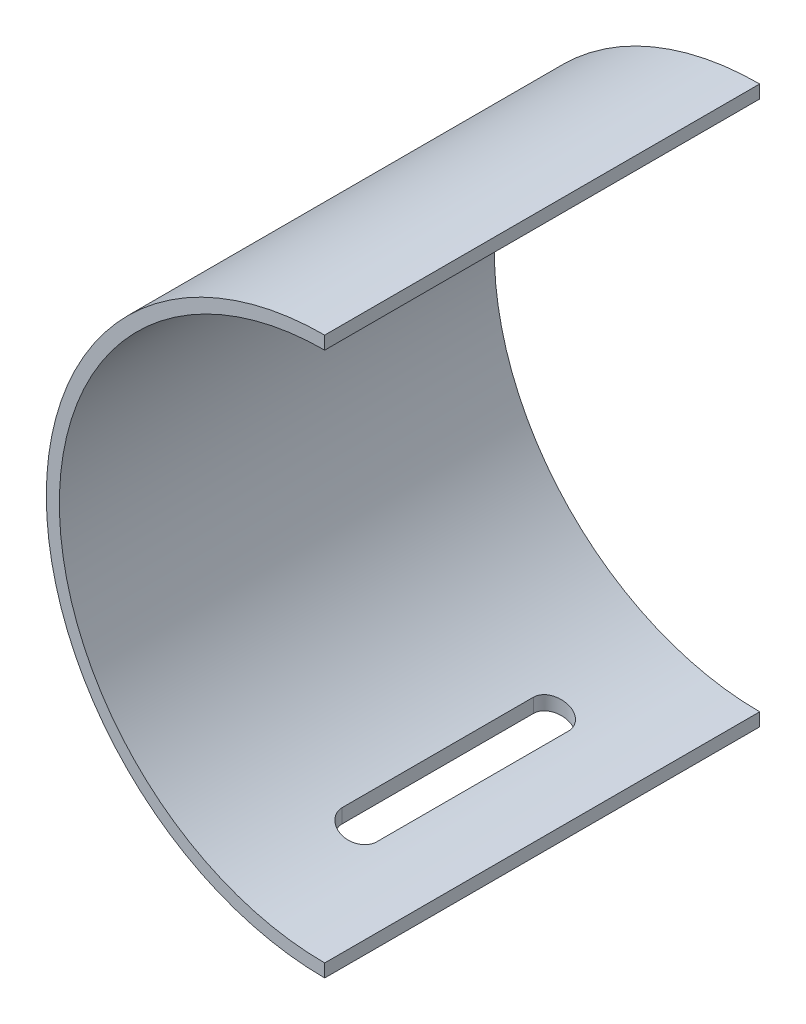
ISO-10303-21;
HEADER;
FILE_DESCRIPTION(('STEP AP214'),'2;1');
FILE_NAME('part.step','',(''),(''),'','','');
FILE_SCHEMA(('AUTOMOTIVE_DESIGN { 1 0 10303 214 1 1 1 1 }'));
ENDSEC;
DATA;
#1=APPLICATION_CONTEXT('core data for automotive mechanical design processes');
#2=APPLICATION_PROTOCOL_DEFINITION('international standard','automotive_design',2000,#1);
#3=PRODUCT_CONTEXT('',#1,'mechanical');
#4=PRODUCT('Part','Part','',(#3));
#5=PRODUCT_RELATED_PRODUCT_CATEGORY('part','',(#4));
#6=PRODUCT_DEFINITION_FORMATION('','',#4);
#7=PRODUCT_DEFINITION_CONTEXT('part definition',#1,'design');
#8=PRODUCT_DEFINITION('design','',#6,#7);
#9=PRODUCT_DEFINITION_SHAPE('','',#8);
#10=(LENGTH_UNIT() NAMED_UNIT(*) SI_UNIT(.MILLI.,.METRE.));
#11=(NAMED_UNIT(*) PLANE_ANGLE_UNIT() SI_UNIT($,.RADIAN.));
#12=(NAMED_UNIT(*) SI_UNIT($,.STERADIAN.) SOLID_ANGLE_UNIT());
#13=UNCERTAINTY_MEASURE_WITH_UNIT(LENGTH_MEASURE(1.E-05),#10,'distance_accuracy_value','');
#14=(GEOMETRIC_REPRESENTATION_CONTEXT(3) GLOBAL_UNCERTAINTY_ASSIGNED_CONTEXT((#13)) GLOBAL_UNIT_ASSIGNED_CONTEXT((#10,
#11,#12)) REPRESENTATION_CONTEXT('',''));
#15=CARTESIAN_POINT('',(0.,0.,0.));
#16=DIRECTION('',(0.,0.,1.));
#17=DIRECTION('',(1.,0.,0.));
#18=AXIS2_PLACEMENT_3D('',#15,#16,#17);
#19=CARTESIAN_POINT('',(0.,0.,25.));
#20=DIRECTION('',(0.,0.,-1.));
#21=DIRECTION('',(-1.,0.,0.));
#22=AXIS2_PLACEMENT_3D('',#19,#20,#21);
#23=CYLINDRICAL_SURFACE('',#22,16.);
#24=DIRECTION('',(0.,0.,-1.));
#25=VECTOR('',#24,1.);
#26=CARTESIAN_POINT('',(-4.,-15.4919333848297,25.));
#27=LINE('',#26,#25);
#28=CARTESIAN_POINT('',(-4.,-15.4919333848297,18.));
#29=VERTEX_POINT('',#28);
#30=CARTESIAN_POINT('',(-4.,-15.4919333848297,7.));
#31=VERTEX_POINT('',#30);
#32=EDGE_CURVE('E118',#29,#31,#27,.T.);
#33=ORIENTED_EDGE('',*,*,#32,.T.);
#34=CARTESIAN_POINT('',(-4.,-15.4919333848297,7.));
#35=CARTESIAN_POINT('',(-3.99999973983562,-15.4919330247826,6.97256292090004));
#36=CARTESIAN_POINT('',(-4.00112994232878,-15.4916416818939,6.94513916553065));
#37=CARTESIAN_POINT('',(-4.00563579160022,-15.4904773948194,6.89049185793874));
#38=CARTESIAN_POINT('',(-4.00901122045016,-15.48960450708,6.86326828654504));
#39=CARTESIAN_POINT('',(-4.02246152576873,-15.4861194126377,6.78227618443451));
#40=CARTESIAN_POINT('',(-4.03586058732038,-15.4826407635821,6.72905677349611));
#41=CARTESIAN_POINT('',(-4.07107973850288,-15.4734171015838,6.62571065428171));
#42=CARTESIAN_POINT('',(-4.09290179545415,-15.4676715591661,6.57558467169842));
#43=CARTESIAN_POINT('',(-4.14424580130178,-15.4539939771053,6.47977179529503));
#44=CARTESIAN_POINT('',(-4.17376760531779,-15.4460619786028,6.43408481797171));
#45=CARTESIAN_POINT('',(-4.23994099866851,-15.4280292240394,6.34785114576807));
#46=CARTESIAN_POINT('',(-4.27666957428775,-15.4179049155632,6.30736855077202));
#47=CARTESIAN_POINT('',(-4.35589502491443,-15.3957094203021,6.23313824088572));
#48=CARTESIAN_POINT('',(-4.39839330505151,-15.3836377591319,6.19939217154167));
#49=CARTESIAN_POINT('',(-4.48925876034375,-15.357371373844,6.13847524649913));
#50=CARTESIAN_POINT('',(-4.53776472325966,-15.3431234133016,6.11153454278722));
#51=CARTESIAN_POINT('',(-4.63814271594516,-15.3130786128445,6.06613962145427));
#52=CARTESIAN_POINT('',(-4.69001517054129,-15.2972815773188,6.04768647728641));
#53=CARTESIAN_POINT('',(-4.79784143481776,-15.2638143076667,6.01899670388754));
#54=CARTESIAN_POINT('',(-4.85387549128621,-15.2460943294004,6.00911972091497));
#55=CARTESIAN_POINT('',(-4.96652598196081,-15.209770703552,5.99896050908363));
#56=CARTESIAN_POINT('',(-5.02314255391275,-15.1911668430149,5.99868060432331));
#57=CARTESIAN_POINT('',(-5.13759243796357,-15.1528518293431,6.00778768975717));
#58=CARTESIAN_POINT('',(-5.19539199517962,-15.1331252922097,6.01753683141622));
#59=CARTESIAN_POINT('',(-5.30846844344179,-15.093831482944,6.04697236293841));
#60=CARTESIAN_POINT('',(-5.36374493414325,-15.0742642364888,6.06666032389637));
#61=CARTESIAN_POINT('',(-5.4710087399841,-15.0356695644859,6.11587248681972));
#62=CARTESIAN_POINT('',(-5.52293807533286,-15.0166537786964,6.14553263695816));
#63=CARTESIAN_POINT('',(-5.62105238553934,-14.9802040002159,6.21395347227302));
#64=CARTESIAN_POINT('',(-5.66723805748111,-14.9627698156423,6.25271305143826));
#65=CARTESIAN_POINT('',(-5.75111126181659,-14.9307294803238,6.33722027957567));
#66=CARTESIAN_POINT('',(-5.78899952871494,-14.9160581275467,6.38274342707655));
#67=CARTESIAN_POINT('',(-5.85645506255707,-14.8897028485076,6.48038402558137));
#68=CARTESIAN_POINT('',(-5.88602305643827,-14.8780186612669,6.53250089991811));
#69=CARTESIAN_POINT('',(-5.93396582870289,-14.8589594169043,6.6382496773566));
#70=CARTESIAN_POINT('',(-5.95293549607883,-14.8513565729964,6.69157155242979));
#71=CARTESIAN_POINT('',(-5.98161499796373,-14.8398290647066,6.80096963668632));
#72=CARTESIAN_POINT('',(-5.99134569990303,-14.8358961117366,6.85703933661442));
#73=CARTESIAN_POINT('',(-5.99750215786954,-14.8334071426752,6.92788870782283));
#74=CARTESIAN_POINT('',(-5.99843914489681,-14.8330282649832,6.94230332362898));
#75=CARTESIAN_POINT('',(-5.99968710555152,-14.8325235835769,6.97114327897172));
#76=CARTESIAN_POINT('',(-5.99999897831321,-14.8323974163762,6.98556857320802));
#77=CARTESIAN_POINT('',(-6.,-14.8323969741913,7.));
#78=B_SPLINE_CURVE_WITH_KNOTS('',3,(#34,#35,#36,#37,#38,#39,#40,#41,#42,#43,#44,#45,#46,#47,#48,
#49,#50,#51,#52,#53,#54,#55,#56,#57,#58,#59,#60,#61,#62,#63,#64,#65,#66,#67,#68,#69,#70,#71,#72,
#73,#74,#75,#76,#77),.UNSPECIFIED.,.F.,.F.,(4,2,2,2,2,2,2,2,2,2,2,2,2,2,2,2,2,2,2,2,2,4),(0.,
0.0822600525181318,0.164512121796549,0.328632789316776,0.492791812967296,0.656947747983393,
0.822963455366363,0.989019666287772,1.16010624544412,1.3312144566099,1.5091927736079,
1.68721419082914,1.87189761633041,2.05661024510666,2.2439506403412,2.43126827663215,
2.6133727842585,2.79546137657634,2.96590530015049,3.13596333122255,3.17930381820689,
3.22258192146009),.UNSPECIFIED.);
#79=CARTESIAN_POINT('',(-6.,-14.8323969741913,7.));
#80=VERTEX_POINT('',#79);
#81=EDGE_CURVE('E112',#31,#80,#78,.T.);
#82=ORIENTED_EDGE('',*,*,#81,.T.);
#83=DIRECTION('',(0.,0.,-1.));
#84=VECTOR('',#83,1.);
#85=CARTESIAN_POINT('',(-6.,-14.8323969741913,25.));
#86=LINE('',#85,#84);
#87=CARTESIAN_POINT('',(-6.,-14.8323969741913,18.));
#88=VERTEX_POINT('',#87);
#89=EDGE_CURVE('E101',#80,#88,#86,.F.);
#90=ORIENTED_EDGE('',*,*,#89,.T.);
#91=CARTESIAN_POINT('',(-6.,-14.8323969741913,18.));
#92=CARTESIAN_POINT('',(-6.0000008520435,-14.8323961879059,18.02672889563));
#93=CARTESIAN_POINT('',(-5.99892760578459,-14.8328308246687,18.0534443272946));
#94=CARTESIAN_POINT('',(-5.99465289693016,-14.8345591300802,18.1066705661017));
#95=CARTESIAN_POINT('',(-5.99145190394329,-14.8358526091764,18.1331814170908));
#96=CARTESIAN_POINT('',(-5.9787184109148,-14.840991029057,18.2119612618623));
#97=CARTESIAN_POINT('',(-5.96605504852281,-14.8460941457176,18.2636802301663));
#98=CARTESIAN_POINT('',(-5.93287936461706,-14.8593827875895,18.3640522696193));
#99=CARTESIAN_POINT('',(-5.9123698244845,-14.8675672204927,18.4127064201015));
#100=CARTESIAN_POINT('',(-5.86423851355928,-14.8866172940697,18.505804774056));
#101=CARTESIAN_POINT('',(-5.83661358461498,-14.8974841252313,18.5502470961037));
#102=CARTESIAN_POINT('',(-5.77411617454355,-14.9218209545457,18.6353129784785));
#103=CARTESIAN_POINT('',(-5.73903261369465,-14.9353657163614,18.6757596291788));
#104=CARTESIAN_POINT('',(-5.66327156151315,-14.9642573497591,18.7502638634287));
#105=CARTESIAN_POINT('',(-5.6225922612015,-14.9796048038763,18.7843193724116));
#106=CARTESIAN_POINT('',(-5.53380822373149,-15.0126398134589,18.8474742600186));
#107=CARTESIAN_POINT('',(-5.48538758776591,-15.0304154026539,18.8760838015739));
#108=CARTESIAN_POINT('',(-5.38470086579088,-15.066780098131,18.9247343691115));
#109=CARTESIAN_POINT('',(-5.33243387279689,-15.0853693958671,18.9447733664922));
#110=CARTESIAN_POINT('',(-5.22267248451847,-15.1237308462318,18.9766491943482));
#111=CARTESIAN_POINT('',(-5.16504739080522,-15.1435154704708,18.9880228535995));
#112=CARTESIAN_POINT('',(-5.04857393819264,-15.1827427779188,19.0005359028899));
#113=CARTESIAN_POINT('',(-4.98972540970631,-15.202185413024,19.0016738644936));
#114=CARTESIAN_POINT('',(-4.87179884618219,-15.2403890474311,18.9935265929885));
#115=CARTESIAN_POINT('',(-4.81272541566208,-15.2591401874158,18.9841264845097));
#116=CARTESIAN_POINT('',(-4.69679305412295,-15.2952221602572,18.9547979258067));
#117=CARTESIAN_POINT('',(-4.63993385209527,-15.3125531672184,18.9348707684081));
#118=CARTESIAN_POINT('',(-4.53168938707401,-15.3449308962526,18.885512251619));
#119=CARTESIAN_POINT('',(-4.48020089432146,-15.3600249345659,18.8563387433986));
#120=CARTESIAN_POINT('',(-4.38280438718998,-15.3880991932979,18.7890314312536));
#121=CARTESIAN_POINT('',(-4.33689479459962,-15.4010800118785,18.750900170377));
#122=CARTESIAN_POINT('',(-4.25407494755664,-15.4241570801834,18.6684799375305));
#123=CARTESIAN_POINT('',(-4.2168677323297,-15.4343515742492,18.6245168040019));
#124=CARTESIAN_POINT('',(-4.15036876422071,-15.452366500228,18.5305084517204));
#125=CARTESIAN_POINT('',(-4.12107769143761,-15.4601867281679,18.480462710928));
#126=CARTESIAN_POINT('',(-4.07240502478738,-15.4730775946559,18.3777328076905));
#127=CARTESIAN_POINT('',(-4.05269880377174,-15.4782387226149,18.3252132079103));
#128=CARTESIAN_POINT('',(-4.02234165402732,-15.4861556948547,18.2174937039346));
#129=CARTESIAN_POINT('',(-4.0116755368278,-15.4889155737332,18.1622984607974));
#130=CARTESIAN_POINT('',(-4.00380101344556,-15.4909515101747,18.0889238314106));
#131=CARTESIAN_POINT('',(-4.00237503985722,-15.491319970325,18.0711555170856));
#132=CARTESIAN_POINT('',(-4.00047585694099,-15.491810561084,18.0355940217186));
#133=CARTESIAN_POINT('',(-4.00000107991749,-15.4919330970083,18.0178009300382));
#134=CARTESIAN_POINT('',(-4.,-15.4919333848297,18.));
#135=B_SPLINE_CURVE_WITH_KNOTS('',3,(#91,#92,#93,#94,#95,#96,#97,#98,#99,#100,#101,#102,#103,
#104,#105,#106,#107,#108,#109,#110,#111,#112,#113,#114,#115,#116,#117,#118,#119,#120,#121,#122,
#123,#124,#125,#126,#127,#128,#129,#130,#131,#132,#133,#134),.UNSPECIFIED.,.F.,.F.,(4,2,2,2,2,2,
2,2,2,2,2,2,2,2,2,2,2,2,2,2,2,4),(0.,0.080135223028483,0.160252765520635,0.319887871738869,
0.479466441476616,0.639115962276051,0.804092716840169,0.969122930639355,1.14529497873773,
1.32150870276538,1.50658428293677,1.69168569079727,1.8788246763324,2.06594068469373,
2.24824014360892,2.43048791129898,2.6050822261618,2.77969153616822,2.94788365636984,
3.11579263005833,3.16926120180057,3.2226415776524),.UNSPECIFIED.);
#136=EDGE_CURVE('E106',#88,#29,#135,.T.);
#137=ORIENTED_EDGE('',*,*,#136,.T.);
#138=EDGE_LOOP('',(#33,#82,#90,#137));
#139=FACE_BOUND('',#138,.T.);
#140=CARTESIAN_POINT('',(0.,0.,0.));
#141=DIRECTION('',(0.,0.,1.));
#142=DIRECTION('',(1.,0.,0.));
#143=AXIS2_PLACEMENT_3D('',#140,#141,#142);
#144=CIRCLE('',#143,16.);
#145=CARTESIAN_POINT('',(0.,16.,0.));
#146=VERTEX_POINT('',#145);
#147=CARTESIAN_POINT('',(0.,-16.,0.));
#148=VERTEX_POINT('',#147);
#149=EDGE_CURVE('E119',#146,#148,#144,.T.);
#150=ORIENTED_EDGE('',*,*,#149,.T.);
#151=DIRECTION('',(0.,0.,-1.));
#152=VECTOR('',#151,1.);
#153=CARTESIAN_POINT('',(0.,-16.,25.));
#154=LINE('',#153,#152);
#155=CARTESIAN_POINT('',(0.,-16.,25.));
#156=VERTEX_POINT('',#155);
#157=EDGE_CURVE('E185',#156,#148,#154,.T.);
#158=ORIENTED_EDGE('',*,*,#157,.F.);
#159=CARTESIAN_POINT('',(0.,0.,25.));
#160=DIRECTION('',(0.,0.,1.));
#161=DIRECTION('',(1.,0.,0.));
#162=AXIS2_PLACEMENT_3D('',#159,#160,#161);
#163=CIRCLE('',#162,16.);
#164=CARTESIAN_POINT('',(0.,16.,25.));
#165=VERTEX_POINT('',#164);
#166=EDGE_CURVE('E131',#165,#156,#163,.T.);
#167=ORIENTED_EDGE('',*,*,#166,.F.);
#168=DIRECTION('',(0.,0.,-1.));
#169=VECTOR('',#168,1.);
#170=CARTESIAN_POINT('',(0.,16.,25.));
#171=LINE('',#170,#169);
#172=EDGE_CURVE('E196',#165,#146,#171,.T.);
#173=ORIENTED_EDGE('',*,*,#172,.T.);
#174=EDGE_LOOP('',(#150,#158,#167,#173));
#175=FACE_BOUND('',#174,.T.);
#176=ADVANCED_FACE('F33',(#139,#175),#23,.T.);
#177=CARTESIAN_POINT('',(0.,-15.25,25.));
#178=DIRECTION('',(-1.,0.,0.));
#179=DIRECTION('',(0.,0.,1.));
#180=AXIS2_PLACEMENT_3D('',#177,#178,#179);
#181=PLANE('',#180);
#182=DIRECTION('',(0.,1.,0.));
#183=VECTOR('',#182,1.);
#184=CARTESIAN_POINT('',(0.,-15.25,0.));
#185=LINE('',#184,#183);
#186=CARTESIAN_POINT('',(0.,-15.25,0.));
#187=VERTEX_POINT('',#186);
#188=EDGE_CURVE('E122',#148,#187,#185,.T.);
#189=ORIENTED_EDGE('',*,*,#188,.T.);
#190=DIRECTION('',(0.,0.,-1.));
#191=VECTOR('',#190,1.);
#192=CARTESIAN_POINT('',(0.,-15.25,25.));
#193=LINE('',#192,#191);
#194=CARTESIAN_POINT('',(0.,-15.25,25.));
#195=VERTEX_POINT('',#194);
#196=EDGE_CURVE('E187',#195,#187,#193,.T.);
#197=ORIENTED_EDGE('',*,*,#196,.F.);
#198=DIRECTION('',(0.,1.,0.));
#199=VECTOR('',#198,1.);
#200=CARTESIAN_POINT('',(0.,-15.25,25.));
#201=LINE('',#200,#199);
#202=EDGE_CURVE('E207',#156,#195,#201,.T.);
#203=ORIENTED_EDGE('',*,*,#202,.F.);
#204=ORIENTED_EDGE('',*,*,#157,.T.);
#205=EDGE_LOOP('',(#189,#197,#203,#204));
#206=FACE_BOUND('',#205,.T.);
#207=ADVANCED_FACE('F154',(#206),#181,.F.);
#208=CARTESIAN_POINT('',(0.,0.,25.));
#209=DIRECTION('',(0.,0.,-1.));
#210=DIRECTION('',(-1.,0.,0.));
#211=AXIS2_PLACEMENT_3D('',#208,#209,#210);
#212=CYLINDRICAL_SURFACE('',#211,15.25);
#213=DIRECTION('',(0.,0.,-1.));
#214=VECTOR('',#213,1.);
#215=CARTESIAN_POINT('',(-6.,-14.02007489281,25.));
#216=LINE('',#215,#214);
#217=CARTESIAN_POINT('',(-6.,-14.02007489281,18.));
#218=VERTEX_POINT('',#217);
#219=CARTESIAN_POINT('',(-6.,-14.02007489281,7.));
#220=VERTEX_POINT('',#219);
#221=EDGE_CURVE('E165',#218,#220,#216,.T.);
#222=ORIENTED_EDGE('',*,*,#221,.T.);
#223=CARTESIAN_POINT('',(-6.,-14.02007489281,7.));
#224=CARTESIAN_POINT('',(-6.0000009517237,-14.0200740202685,6.97341703752054));
#225=CARTESIAN_POINT('',(-5.99893927682452,-14.0205288851952,6.94684754616679));
#226=CARTESIAN_POINT('',(-5.99471139359388,-14.0223372949638,6.89391362612556));
#227=CARTESIAN_POINT('',(-5.99154568969447,-14.0236906244027,6.86754914981897));
#228=CARTESIAN_POINT('',(-5.97895615397309,-14.0290652308148,6.78921848016366));
#229=CARTESIAN_POINT('',(-5.96643951632117,-14.0344013475904,6.73780184824804));
#230=CARTESIAN_POINT('',(-5.93366848980978,-14.0482877944197,6.63802705266305));
#231=CARTESIAN_POINT('',(-5.91341752323385,-14.0568367028515,6.58966754729202));
#232=CARTESIAN_POINT('',(-5.86592035975518,-14.0767233120869,6.4971201558832));
#233=CARTESIAN_POINT('',(-5.83867060459626,-14.0880624313391,6.45293440750221));
#234=CARTESIAN_POINT('',(-5.77695453870017,-14.1134845780279,6.36818518929233));
#235=CARTESIAN_POINT('',(-5.74226042695207,-14.1276529082227,6.32781371782164));
#236=CARTESIAN_POINT('',(-5.66735516781194,-14.157867627559,6.25338965249668));
#237=CARTESIAN_POINT('',(-5.6271421840468,-14.1739146415595,6.21933917082538));
#238=CARTESIAN_POINT('',(-5.53907233150255,-14.2085740503904,6.15586580309763));
#239=CARTESIAN_POINT('',(-5.4908687190483,-14.2272885494209,6.12697942177555));
#240=CARTESIAN_POINT('',(-5.39059952326082,-14.2655815919395,6.07774518461791));
#241=CARTESIAN_POINT('',(-5.33853291116855,-14.2851603650267,6.05739961296744));
#242=CARTESIAN_POINT('',(-5.2288360020778,-14.3256893922949,6.02476251986394));
#243=CARTESIAN_POINT('',(-5.17105742931061,-14.3466550208421,6.01298620029746));
#244=CARTESIAN_POINT('',(-5.05419887684799,-14.3882389840714,5.99973938563632));
#245=CARTESIAN_POINT('',(-4.99511869563442,-14.4088572640917,5.99827049777184));
#246=CARTESIAN_POINT('',(-4.87654661213838,-14.4494210046271,6.00585106331761));
#247=CARTESIAN_POINT('',(-4.81705902913567,-14.4693545738439,6.01503452150432));
#248=CARTESIAN_POINT('',(-4.70024167046277,-14.5077223559213,6.04408903062727));
#249=CARTESIAN_POINT('',(-4.64291160524894,-14.5261567703601,6.0639586419461));
#250=CARTESIAN_POINT('',(-4.53385874533724,-14.5605564911266,6.11332473909982));
#251=CARTESIAN_POINT('',(-4.4820233313896,-14.5765768179528,6.14253355903713));
#252=CARTESIAN_POINT('',(-4.38393760721465,-14.6063760250664,6.2100577457379));
#253=CARTESIAN_POINT('',(-4.33768555468891,-14.6201556050514,6.24837026054088));
#254=CARTESIAN_POINT('',(-4.25444225466291,-14.6445901375483,6.3311004197905));
#255=CARTESIAN_POINT('',(-4.2171204205149,-14.6553605783424,6.3751513974079));
#256=CARTESIAN_POINT('',(-4.15041226018828,-14.6743921795425,6.46940476964764));
#257=CARTESIAN_POINT('',(-4.12102640113804,-14.6826531922417,6.51960752612403));
#258=CARTESIAN_POINT('',(-4.07231797014301,-14.6962356379195,6.62248762411951));
#259=CARTESIAN_POINT('',(-4.05263366053343,-14.701663275544,6.67498037095761));
#260=CARTESIAN_POINT('',(-4.02230897133049,-14.709989203176,6.78265982077076));
#261=CARTESIAN_POINT('',(-4.01165324018912,-14.7128917868298,6.83784178151481));
#262=CARTESIAN_POINT('',(-4.0037918081082,-14.7150315120666,6.91118362432902));
#263=CARTESIAN_POINT('',(-4.00236930444774,-14.7154184558923,6.9289302900394));
#264=CARTESIAN_POINT('',(-4.0004747243716,-14.71593366142,6.96444873989527));
#265=CARTESIAN_POINT('',(-4.00000108669614,-14.7160623480579,6.98222043455171));
#266=CARTESIAN_POINT('',(-4.,-14.7160626527614,7.));
#267=B_SPLINE_CURVE_WITH_KNOTS('',3,(#223,#224,#225,#226,#227,#228,#229,#230,#231,#232,#233,
#234,#235,#236,#237,#238,#239,#240,#241,#242,#243,#244,#245,#246,#247,#248,#249,#250,#251,#252,
#253,#254,#255,#256,#257,#258,#259,#260,#261,#262,#263,#264,#265,#266),.UNSPECIFIED.,.F.,.F.,(4,
2,2,2,2,2,2,2,2,2,2,2,2,2,2,2,2,2,2,2,2,4),(0.,0.079697435734223,0.159375771233883,
0.318101378258354,0.476756833640438,0.635493111312853,0.800044541279809,0.964650858148532,
1.14156713295997,1.31853069280326,1.50541057167995,1.6923195899502,1.88160562721959,
2.07086617063381,2.25478275351953,2.4386417957138,2.61395258929253,2.78927369978953,
2.9574400523793,3.12531988983804,3.17872403028124,3.23204022738546),.UNSPECIFIED.);
#268=CARTESIAN_POINT('',(-4.,-14.7160626527614,7.));
#269=VERTEX_POINT('',#268);
#270=EDGE_CURVE('E11',#220,#269,#267,.T.);
#271=ORIENTED_EDGE('',*,*,#270,.T.);
#272=DIRECTION('',(0.,0.,-1.));
#273=VECTOR('',#272,1.);
#274=CARTESIAN_POINT('',(-4.,-14.7160626527614,25.));
#275=LINE('',#274,#273);
#276=CARTESIAN_POINT('',(-4.,-14.7160626527614,18.));
#277=VERTEX_POINT('',#276);
#278=EDGE_CURVE('E47',#269,#277,#275,.F.);
#279=ORIENTED_EDGE('',*,*,#278,.T.);
#280=CARTESIAN_POINT('',(-4.,-14.7160626527614,18.));
#281=CARTESIAN_POINT('',(-3.99999969642953,-14.7160622870358,18.0273658062516));
#282=CARTESIAN_POINT('',(-4.00112408391933,-14.7157571625541,18.0547183037965));
#283=CARTESIAN_POINT('',(-4.00560644476384,-14.7145378791667,18.1092231936966));
#284=CARTESIAN_POINT('',(-4.00896419001887,-14.7136237824571,18.1363756062006));
#285=CARTESIAN_POINT('',(-4.02234263913248,-14.7099745242227,18.2171512484014));
#286=CARTESIAN_POINT('',(-4.03566873131481,-14.7063323814509,18.2702261114158));
#287=CARTESIAN_POINT('',(-4.07068699719464,-14.6966776141434,18.3732887486016));
#288=CARTESIAN_POINT('',(-4.092380928107,-14.6906644917049,18.4232758717995));
#289=CARTESIAN_POINT('',(-4.14340815271285,-14.6763540543664,18.5188280676224));
#290=CARTESIAN_POINT('',(-4.17274144232574,-14.6680567406865,18.5643931426093));
#291=CARTESIAN_POINT('',(-4.23850651627756,-14.6491891712644,18.6504596941645));
#292=CARTESIAN_POINT('',(-4.27502203757186,-14.6385919335353,18.6908911563168));
#293=CARTESIAN_POINT('',(-4.35376608518856,-14.6153653292241,18.7650545804241));
#294=CARTESIAN_POINT('',(-4.39599604733926,-14.602735451763,18.798784853343));
#295=CARTESIAN_POINT('',(-4.48640015932943,-14.5752192359852,18.859818457454));
#296=CARTESIAN_POINT('',(-4.53472559300368,-14.5602716854718,18.8868698949234));
#297=CARTESIAN_POINT('',(-4.634715691004,-14.5287528175933,18.9325179746139));
#298=CARTESIAN_POINT('',(-4.68638083213441,-14.5121812681976,18.9511134065271));
#299=CARTESIAN_POINT('',(-4.79398426133585,-14.4770009102941,18.9802035894063));
#300=CARTESIAN_POINT('',(-4.8500104673425,-14.4583343912393,18.9903033040125));
#301=CARTESIAN_POINT('',(-4.96264864896627,-14.420061012047,19.0009032132534));
#302=CARTESIAN_POINT('',(-5.01926077432933,-14.4004539066206,19.0014008900464));
#303=CARTESIAN_POINT('',(-5.13395218136463,-14.3599750299356,18.9927232832513));
#304=CARTESIAN_POINT('',(-5.19199463669873,-14.3390845673576,18.9831450748696));
#305=CARTESIAN_POINT('',(-5.30557082442353,-14.2974501285635,18.9539735617517));
#306=CARTESIAN_POINT('',(-5.36110410371718,-14.2767061793702,18.9343784560082));
#307=CARTESIAN_POINT('',(-5.46901510050087,-14.2357212676991,18.8852102380821));
#308=CARTESIAN_POINT('',(-5.52132631566022,-14.215494089492,18.8554791042763));
#309=CARTESIAN_POINT('',(-5.62018423253494,-14.1767010124118,18.7867613375467));
#310=CARTESIAN_POINT('',(-5.66673162986512,-14.1581349131442,18.7477758231613));
#311=CARTESIAN_POINT('',(-5.75115872549275,-14.1240464292333,18.6627525502496));
#312=CARTESIAN_POINT('',(-5.78925773568675,-14.108449057278,18.6169633266065));
#313=CARTESIAN_POINT('',(-5.85706563619574,-14.0804344239079,18.5186507613552));
#314=CARTESIAN_POINT('',(-5.88677574613846,-14.0680167002414,18.4661284002663));
#315=CARTESIAN_POINT('',(-5.93469419499267,-14.0478658499306,18.3598649306402));
#316=CARTESIAN_POINT('',(-5.95356912404289,-14.0398628217165,18.3064748004784));
#317=CARTESIAN_POINT('',(-5.98204400292006,-14.0277544508198,18.1969155918201));
#318=CARTESIAN_POINT('',(-5.99166571633916,-14.0236399626748,18.1407533623275));
#319=CARTESIAN_POINT('',(-5.99763313151606,-14.0210875576716,18.0701980249712));
#320=CARTESIAN_POINT('',(-5.99852097105386,-14.0207077495263,18.0561654021173));
#321=CARTESIAN_POINT('',(-5.99970347826765,-14.0202018303171,18.0280904781771));
#322=CARTESIAN_POINT('',(-5.99999898270914,-14.0200753613722,18.0140482188155));
#323=CARTESIAN_POINT('',(-6.,-14.02007489281,18.));
#324=B_SPLINE_CURVE_WITH_KNOTS('',3,(#280,#281,#282,#283,#284,#285,#286,#287,#288,#289,#290,
#291,#292,#293,#294,#295,#296,#297,#298,#299,#300,#301,#302,#303,#304,#305,#306,#307,#308,#309,
#310,#311,#312,#313,#314,#315,#316,#317,#318,#319,#320,#321,#322,#323),.UNSPECIFIED.,.F.,.F.,(4,
2,2,2,2,2,2,2,2,2,2,2,2,2,2,2,2,2,2,2,2,4),(0.,0.0820462984037124,0.164084218452784,
0.327765529787585,0.491481232315816,0.655196847394913,0.820948342165643,0.986741561777732,
1.15806474282664,1.32941243764747,1.50834526026887,1.68732500193283,1.873744191037,
2.06019690953293,2.2497005149153,2.43918122744052,2.62293960711043,2.80667125713272,
2.9773646932832,3.14765566889505,3.18984437801802,3.23197344690451),.UNSPECIFIED.);
#325=EDGE_CURVE('E158',#277,#218,#324,.T.);
#326=ORIENTED_EDGE('',*,*,#325,.T.);
#327=EDGE_LOOP('',(#222,#271,#279,#326));
#328=FACE_BOUND('',#327,.T.);
#329=CARTESIAN_POINT('',(0.,0.,0.));
#330=DIRECTION('',(0.,0.,-1.));
#331=DIRECTION('',(1.,0.,0.));
#332=AXIS2_PLACEMENT_3D('',#329,#330,#331);
#333=CIRCLE('',#332,15.25);
#334=CARTESIAN_POINT('',(0.,15.25,0.));
#335=VERTEX_POINT('',#334);
#336=EDGE_CURVE('E202',#187,#335,#333,.T.);
#337=ORIENTED_EDGE('',*,*,#336,.T.);
#338=DIRECTION('',(0.,0.,-1.));
#339=VECTOR('',#338,1.);
#340=CARTESIAN_POINT('',(0.,15.25,25.));
#341=LINE('',#340,#339);
#342=CARTESIAN_POINT('',(0.,15.25,25.));
#343=VERTEX_POINT('',#342);
#344=EDGE_CURVE('E191',#343,#335,#341,.T.);
#345=ORIENTED_EDGE('',*,*,#344,.F.);
#346=CARTESIAN_POINT('',(0.,0.,25.));
#347=DIRECTION('',(0.,0.,-1.));
#348=DIRECTION('',(1.,0.,0.));
#349=AXIS2_PLACEMENT_3D('',#346,#347,#348);
#350=CIRCLE('',#349,15.25);
#351=EDGE_CURVE('E206',#195,#343,#350,.T.);
#352=ORIENTED_EDGE('',*,*,#351,.F.);
#353=ORIENTED_EDGE('',*,*,#196,.T.);
#354=EDGE_LOOP('',(#337,#345,#352,#353));
#355=FACE_BOUND('',#354,.T.);
#356=ADVANCED_FACE('F150',(#328,#355),#212,.F.);
#357=CARTESIAN_POINT('',(0.,16.,25.));
#358=DIRECTION('',(-1.,0.,0.));
#359=DIRECTION('',(0.,0.,1.));
#360=AXIS2_PLACEMENT_3D('',#357,#358,#359);
#361=PLANE('',#360);
#362=DIRECTION('',(0.,1.,0.));
#363=VECTOR('',#362,1.);
#364=CARTESIAN_POINT('',(0.,16.,0.));
#365=LINE('',#364,#363);
#366=EDGE_CURVE('E200',#335,#146,#365,.T.);
#367=ORIENTED_EDGE('',*,*,#366,.T.);
#368=ORIENTED_EDGE('',*,*,#172,.F.);
#369=DIRECTION('',(0.,1.,0.));
#370=VECTOR('',#369,1.);
#371=CARTESIAN_POINT('',(0.,16.,25.));
#372=LINE('',#371,#370);
#373=EDGE_CURVE('E199',#343,#165,#372,.T.);
#374=ORIENTED_EDGE('',*,*,#373,.F.);
#375=ORIENTED_EDGE('',*,*,#344,.T.);
#376=EDGE_LOOP('',(#367,#368,#374,#375));
#377=FACE_BOUND('',#376,.T.);
#378=ADVANCED_FACE('F144',(#377),#361,.F.);
#379=CARTESIAN_POINT('',(0.,0.,25.));
#380=DIRECTION('',(0.,0.,1.));
#381=DIRECTION('',(1.,0.,0.));
#382=AXIS2_PLACEMENT_3D('',#379,#380,#381);
#383=PLANE('',#382);
#384=ORIENTED_EDGE('',*,*,#166,.T.);
#385=ORIENTED_EDGE('',*,*,#202,.T.);
#386=ORIENTED_EDGE('',*,*,#351,.T.);
#387=ORIENTED_EDGE('',*,*,#373,.T.);
#388=EDGE_LOOP('',(#384,#385,#386,#387));
#389=FACE_BOUND('',#388,.T.);
#390=ADVANCED_FACE('F140',(#389),#383,.T.);
#391=CARTESIAN_POINT('',(0.,0.,0.));
#392=DIRECTION('',(0.,0.,1.));
#393=DIRECTION('',(1.,0.,0.));
#394=AXIS2_PLACEMENT_3D('',#391,#392,#393);
#395=PLANE('',#394);
#396=ORIENTED_EDGE('',*,*,#149,.F.);
#397=ORIENTED_EDGE('',*,*,#366,.F.);
#398=ORIENTED_EDGE('',*,*,#336,.F.);
#399=ORIENTED_EDGE('',*,*,#188,.F.);
#400=EDGE_LOOP('',(#396,#397,#398,#399));
#401=FACE_BOUND('',#400,.T.);
#402=ADVANCED_FACE('F138',(#401),#395,.F.);
#403=CARTESIAN_POINT('',(-5.,-25.,7.));
#404=DIRECTION('',(0.,1.,0.));
#405=DIRECTION('',(0.,0.,1.));
#406=AXIS2_PLACEMENT_3D('',#403,#404,#405);
#407=CYLINDRICAL_SURFACE('',#406,1.);
#408=DIRECTION('',(0.,1.,0.));
#409=VECTOR('',#408,1.);
#410=CARTESIAN_POINT('',(-4.,-25.,7.));
#411=LINE('',#410,#409);
#412=EDGE_CURVE('E107',#31,#269,#411,.T.);
#413=ORIENTED_EDGE('',*,*,#412,.T.);
#414=ORIENTED_EDGE('',*,*,#270,.F.);
#415=DIRECTION('',(0.,1.,0.));
#416=VECTOR('',#415,1.);
#417=CARTESIAN_POINT('',(-6.,-25.,7.));
#418=LINE('',#417,#416);
#419=EDGE_CURVE('E59',#80,#220,#418,.T.);
#420=ORIENTED_EDGE('',*,*,#419,.F.);
#421=ORIENTED_EDGE('',*,*,#81,.F.);
#422=EDGE_LOOP('',(#413,#414,#420,#421));
#423=FACE_BOUND('',#422,.T.);
#424=ADVANCED_FACE('F111',(#423),#407,.F.);
#425=CARTESIAN_POINT('',(-4.,-25.,7.));
#426=DIRECTION('',(1.,0.,0.));
#427=DIRECTION('',(0.,0.,-1.));
#428=AXIS2_PLACEMENT_3D('',#425,#426,#427);
#429=PLANE('',#428);
#430=DIRECTION('',(0.,1.,0.));
#431=VECTOR('',#430,1.);
#432=CARTESIAN_POINT('',(-4.,-25.,18.));
#433=LINE('',#432,#431);
#434=EDGE_CURVE('E179',#29,#277,#433,.T.);
#435=ORIENTED_EDGE('',*,*,#434,.T.);
#436=ORIENTED_EDGE('',*,*,#278,.F.);
#437=ORIENTED_EDGE('',*,*,#412,.F.);
#438=ORIENTED_EDGE('',*,*,#32,.F.);
#439=EDGE_LOOP('',(#435,#436,#437,#438));
#440=FACE_BOUND('',#439,.T.);
#441=ADVANCED_FACE('F137',(#440),#429,.F.);
#442=CARTESIAN_POINT('',(-5.,-25.,18.));
#443=DIRECTION('',(0.,1.,0.));
#444=DIRECTION('',(0.,0.,1.));
#445=AXIS2_PLACEMENT_3D('',#442,#443,#444);
#446=CYLINDRICAL_SURFACE('',#445,1.);
#447=DIRECTION('',(0.,1.,0.));
#448=VECTOR('',#447,1.);
#449=CARTESIAN_POINT('',(-6.,-25.,18.));
#450=LINE('',#449,#448);
#451=EDGE_CURVE('E54',#88,#218,#450,.T.);
#452=ORIENTED_EDGE('',*,*,#451,.T.);
#453=ORIENTED_EDGE('',*,*,#325,.F.);
#454=ORIENTED_EDGE('',*,*,#434,.F.);
#455=ORIENTED_EDGE('',*,*,#136,.F.);
#456=EDGE_LOOP('',(#452,#453,#454,#455));
#457=FACE_BOUND('',#456,.T.);
#458=ADVANCED_FACE('F167',(#457),#446,.F.);
#459=CARTESIAN_POINT('',(-6.,-25.,7.));
#460=DIRECTION('',(-1.,0.,0.));
#461=DIRECTION('',(0.,0.,1.));
#462=AXIS2_PLACEMENT_3D('',#459,#460,#461);
#463=PLANE('',#462);
#464=ORIENTED_EDGE('',*,*,#419,.T.);
#465=ORIENTED_EDGE('',*,*,#221,.F.);
#466=ORIENTED_EDGE('',*,*,#451,.F.);
#467=ORIENTED_EDGE('',*,*,#89,.F.);
#468=EDGE_LOOP('',(#464,#465,#466,#467));
#469=FACE_BOUND('',#468,.T.);
#470=ADVANCED_FACE('F102',(#469),#463,.F.);
#471=CLOSED_SHELL('',(#176,#207,#356,#378,#390,#402,#424,#441,#458,#470));
#472=MANIFOLD_SOLID_BREP('B2',#471);
#473=ADVANCED_BREP_SHAPE_REPRESENTATION('',(#18,#472),#14);
#474=SHAPE_DEFINITION_REPRESENTATION(#9,#473);
ENDSEC;
END-ISO-10303-21;
